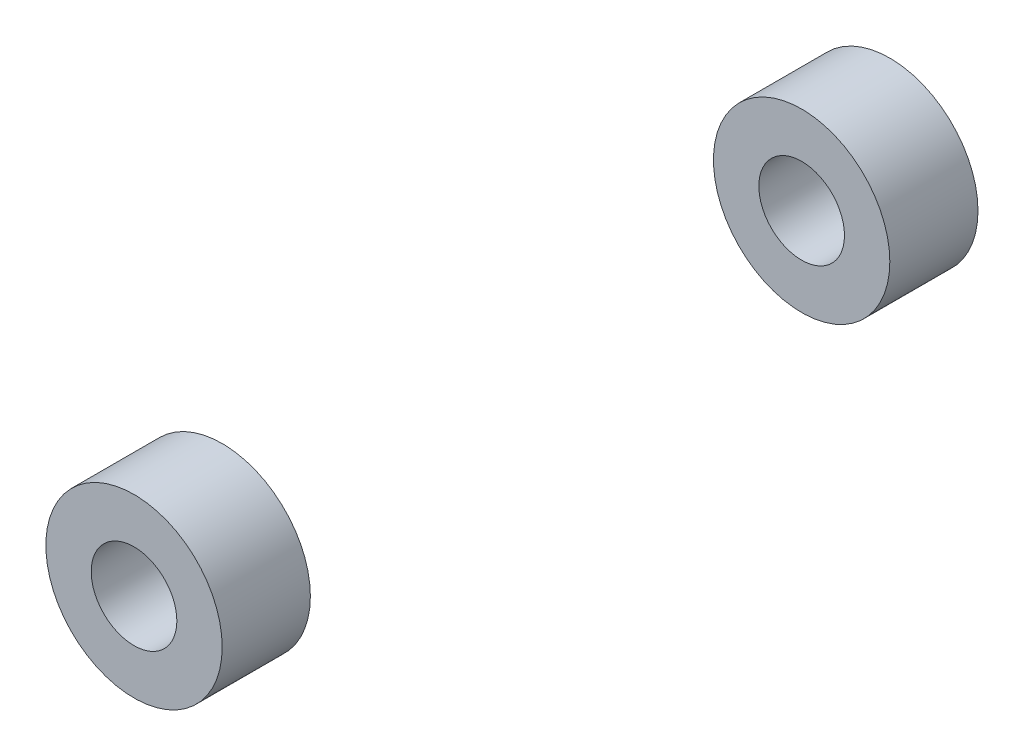
ISO-10303-21;
HEADER;
FILE_DESCRIPTION(('STEP AP214'),'2;1');
FILE_NAME('part.step','',(''),(''),'','','');
FILE_SCHEMA(('AUTOMOTIVE_DESIGN { 1 0 10303 214 1 1 1 1 }'));
ENDSEC;
DATA;
#1=APPLICATION_CONTEXT('core data for automotive mechanical design processes');
#2=APPLICATION_PROTOCOL_DEFINITION('international standard','automotive_design',2000,#1);
#3=PRODUCT_CONTEXT('',#1,'mechanical');
#4=PRODUCT('Part','Part','',(#3));
#5=PRODUCT_RELATED_PRODUCT_CATEGORY('part','',(#4));
#6=PRODUCT_DEFINITION_FORMATION('','',#4);
#7=PRODUCT_DEFINITION_CONTEXT('part definition',#1,'design');
#8=PRODUCT_DEFINITION('design','',#6,#7);
#9=PRODUCT_DEFINITION_SHAPE('','',#8);
#10=(LENGTH_UNIT() NAMED_UNIT(*) SI_UNIT(.MILLI.,.METRE.));
#11=(NAMED_UNIT(*) PLANE_ANGLE_UNIT() SI_UNIT($,.RADIAN.));
#12=(NAMED_UNIT(*) SI_UNIT($,.STERADIAN.) SOLID_ANGLE_UNIT());
#13=UNCERTAINTY_MEASURE_WITH_UNIT(LENGTH_MEASURE(1.E-05),#10,'distance_accuracy_value','');
#14=(GEOMETRIC_REPRESENTATION_CONTEXT(3) GLOBAL_UNCERTAINTY_ASSIGNED_CONTEXT((#13)) GLOBAL_UNIT_ASSIGNED_CONTEXT((#10,
#11,#12)) REPRESENTATION_CONTEXT('',''));
#15=CARTESIAN_POINT('',(0.,0.,0.));
#16=DIRECTION('',(0.,0.,1.));
#17=DIRECTION('',(1.,0.,0.));
#18=AXIS2_PLACEMENT_3D('',#15,#16,#17);
#19=CARTESIAN_POINT('',(0.,0.,30.));
#20=DIRECTION('',(0.,0.,-1.));
#21=DIRECTION('',(-1.,0.,0.));
#22=AXIS2_PLACEMENT_3D('',#19,#20,#21);
#23=CYLINDRICAL_SURFACE('',#22,3.5);
#24=CARTESIAN_POINT('',(0.,0.,0.));
#25=DIRECTION('',(0.,0.,1.));
#26=DIRECTION('',(1.,0.,0.));
#27=AXIS2_PLACEMENT_3D('',#24,#25,#26);
#28=CIRCLE('',#27,3.5);
#29=CARTESIAN_POINT('',(3.5,0.,0.));
#30=VERTEX_POINT('',#29);
#31=EDGE_CURVE('E62',#30,#30,#28,.T.);
#32=ORIENTED_EDGE('',*,*,#31,.T.);
#33=EDGE_LOOP('',(#32));
#34=FACE_BOUND('',#33,.T.);
#35=CARTESIAN_POINT('',(0.,0.,3.5));
#36=DIRECTION('',(0.,0.,1.));
#37=DIRECTION('',(1.,0.,0.));
#38=AXIS2_PLACEMENT_3D('',#35,#36,#37);
#39=CIRCLE('',#38,3.5);
#40=CARTESIAN_POINT('',(3.5,0.,3.5));
#41=VERTEX_POINT('',#40);
#42=EDGE_CURVE('E11',#41,#41,#39,.T.);
#43=ORIENTED_EDGE('',*,*,#42,.F.);
#44=EDGE_LOOP('',(#43));
#45=FACE_BOUND('',#44,.T.);
#46=ADVANCED_FACE('F47',(#34,#45),#23,.T.);
#47=CARTESIAN_POINT('',(0.,0.,30.));
#48=DIRECTION('',(0.,0.,-1.));
#49=DIRECTION('',(-1.,0.,0.));
#50=AXIS2_PLACEMENT_3D('',#47,#48,#49);
#51=CYLINDRICAL_SURFACE('',#50,1.7);
#52=CARTESIAN_POINT('',(0.,0.,0.));
#53=DIRECTION('',(0.,0.,1.));
#54=DIRECTION('',(1.,0.,0.));
#55=AXIS2_PLACEMENT_3D('',#52,#53,#54);
#56=CIRCLE('',#55,1.7);
#57=CARTESIAN_POINT('',(1.7,0.,0.));
#58=VERTEX_POINT('',#57);
#59=EDGE_CURVE('E54',#58,#58,#56,.T.);
#60=ORIENTED_EDGE('',*,*,#59,.F.);
#61=EDGE_LOOP('',(#60));
#62=FACE_BOUND('',#61,.T.);
#63=CARTESIAN_POINT('',(0.,0.,3.5));
#64=DIRECTION('',(0.,0.,1.));
#65=DIRECTION('',(1.,0.,0.));
#66=AXIS2_PLACEMENT_3D('',#63,#64,#65);
#67=CIRCLE('',#66,1.7);
#68=CARTESIAN_POINT('',(1.7,0.,3.5));
#69=VERTEX_POINT('',#68);
#70=EDGE_CURVE('E58',#69,#69,#67,.T.);
#71=ORIENTED_EDGE('',*,*,#70,.T.);
#72=EDGE_LOOP('',(#71));
#73=FACE_BOUND('',#72,.T.);
#74=ADVANCED_FACE('F49',(#62,#73),#51,.F.);
#75=CARTESIAN_POINT('',(0.,0.,0.));
#76=DIRECTION('',(0.,0.,1.));
#77=DIRECTION('',(1.,0.,0.));
#78=AXIS2_PLACEMENT_3D('',#75,#76,#77);
#79=PLANE('',#78);
#80=ORIENTED_EDGE('',*,*,#31,.F.);
#81=EDGE_LOOP('',(#80));
#82=FACE_BOUND('',#81,.T.);
#83=ORIENTED_EDGE('',*,*,#59,.T.);
#84=EDGE_LOOP('',(#83));
#85=FACE_BOUND('',#84,.T.);
#86=ADVANCED_FACE('F70',(#82,#85),#79,.F.);
#87=CARTESIAN_POINT('',(0.,0.,3.5));
#88=DIRECTION('',(0.,0.,1.));
#89=DIRECTION('',(1.,0.,0.));
#90=AXIS2_PLACEMENT_3D('',#87,#88,#89);
#91=PLANE('',#90);
#92=ORIENTED_EDGE('',*,*,#70,.F.);
#93=EDGE_LOOP('',(#92));
#94=FACE_BOUND('',#93,.T.);
#95=ORIENTED_EDGE('',*,*,#42,.T.);
#96=EDGE_LOOP('',(#95));
#97=FACE_BOUND('',#96,.T.);
#98=ADVANCED_FACE('F72',(#94,#97),#91,.T.);
#99=CLOSED_SHELL('',(#46,#74,#86,#98));
#100=MANIFOLD_SOLID_BREP('B2',#99);
#101=CARTESIAN_POINT('',(0.,0.,30.));
#102=DIRECTION('',(0.,0.,-1.));
#103=DIRECTION('',(-1.,0.,0.));
#104=AXIS2_PLACEMENT_3D('',#101,#102,#103);
#105=CYLINDRICAL_SURFACE('',#104,3.5);
#106=CARTESIAN_POINT('',(0.,0.,26.5));
#107=DIRECTION('',(0.,0.,1.));
#108=DIRECTION('',(1.,0.,0.));
#109=AXIS2_PLACEMENT_3D('',#106,#107,#108);
#110=CIRCLE('',#109,3.5);
#111=CARTESIAN_POINT('',(3.5,0.,26.5));
#112=VERTEX_POINT('',#111);
#113=EDGE_CURVE('E122',#112,#112,#110,.T.);
#114=ORIENTED_EDGE('',*,*,#113,.T.);
#115=EDGE_LOOP('',(#114));
#116=FACE_BOUND('',#115,.T.);
#117=CARTESIAN_POINT('',(0.,0.,30.));
#118=DIRECTION('',(0.,0.,1.));
#119=DIRECTION('',(1.,0.,0.));
#120=AXIS2_PLACEMENT_3D('',#117,#118,#119);
#121=CIRCLE('',#120,3.5);
#122=CARTESIAN_POINT('',(3.5,0.,30.));
#123=VERTEX_POINT('',#122);
#124=EDGE_CURVE('E46',#123,#123,#121,.T.);
#125=ORIENTED_EDGE('',*,*,#124,.F.);
#126=EDGE_LOOP('',(#125));
#127=FACE_BOUND('',#126,.T.);
#128=ADVANCED_FACE('F109',(#116,#127),#105,.T.);
#129=CARTESIAN_POINT('',(0.,0.,30.));
#130=DIRECTION('',(0.,0.,1.));
#131=DIRECTION('',(1.,0.,0.));
#132=AXIS2_PLACEMENT_3D('',#129,#130,#131);
#133=PLANE('',#132);
#134=ORIENTED_EDGE('',*,*,#124,.T.);
#135=EDGE_LOOP('',(#134));
#136=FACE_BOUND('',#135,.T.);
#137=CARTESIAN_POINT('',(0.,0.,30.));
#138=DIRECTION('',(0.,0.,1.));
#139=DIRECTION('',(1.,0.,0.));
#140=AXIS2_PLACEMENT_3D('',#137,#138,#139);
#141=CIRCLE('',#140,1.7);
#142=CARTESIAN_POINT('',(1.7,0.,30.));
#143=VERTEX_POINT('',#142);
#144=EDGE_CURVE('E116',#143,#143,#141,.T.);
#145=ORIENTED_EDGE('',*,*,#144,.F.);
#146=EDGE_LOOP('',(#145));
#147=FACE_BOUND('',#146,.T.);
#148=ADVANCED_FACE('F135',(#136,#147),#133,.T.);
#149=CARTESIAN_POINT('',(0.,0.,30.));
#150=DIRECTION('',(0.,0.,-1.));
#151=DIRECTION('',(-1.,0.,0.));
#152=AXIS2_PLACEMENT_3D('',#149,#150,#151);
#153=CYLINDRICAL_SURFACE('',#152,1.7);
#154=CARTESIAN_POINT('',(0.,0.,26.5));
#155=DIRECTION('',(0.,0.,1.));
#156=DIRECTION('',(1.,0.,0.));
#157=AXIS2_PLACEMENT_3D('',#154,#155,#156);
#158=CIRCLE('',#157,1.7);
#159=CARTESIAN_POINT('',(1.7,0.,26.5));
#160=VERTEX_POINT('',#159);
#161=EDGE_CURVE('E112',#160,#160,#158,.T.);
#162=ORIENTED_EDGE('',*,*,#161,.F.);
#163=EDGE_LOOP('',(#162));
#164=FACE_BOUND('',#163,.T.);
#165=ORIENTED_EDGE('',*,*,#144,.T.);
#166=EDGE_LOOP('',(#165));
#167=FACE_BOUND('',#166,.T.);
#168=ADVANCED_FACE('F132',(#164,#167),#153,.F.);
#169=CARTESIAN_POINT('',(0.,0.,26.5));
#170=DIRECTION('',(0.,0.,1.));
#171=DIRECTION('',(1.,0.,0.));
#172=AXIS2_PLACEMENT_3D('',#169,#170,#171);
#173=PLANE('',#172);
#174=ORIENTED_EDGE('',*,*,#161,.T.);
#175=EDGE_LOOP('',(#174));
#176=FACE_BOUND('',#175,.T.);
#177=ORIENTED_EDGE('',*,*,#113,.F.);
#178=EDGE_LOOP('',(#177));
#179=FACE_BOUND('',#178,.T.);
#180=ADVANCED_FACE('F129',(#176,#179),#173,.F.);
#181=CLOSED_SHELL('',(#128,#148,#168,#180));
#182=MANIFOLD_SOLID_BREP('B6',#181);
#183=ADVANCED_BREP_SHAPE_REPRESENTATION('',(#18,#100,#182),#14);
#184=SHAPE_DEFINITION_REPRESENTATION(#9,#183);
ENDSEC;
END-ISO-10303-21;
